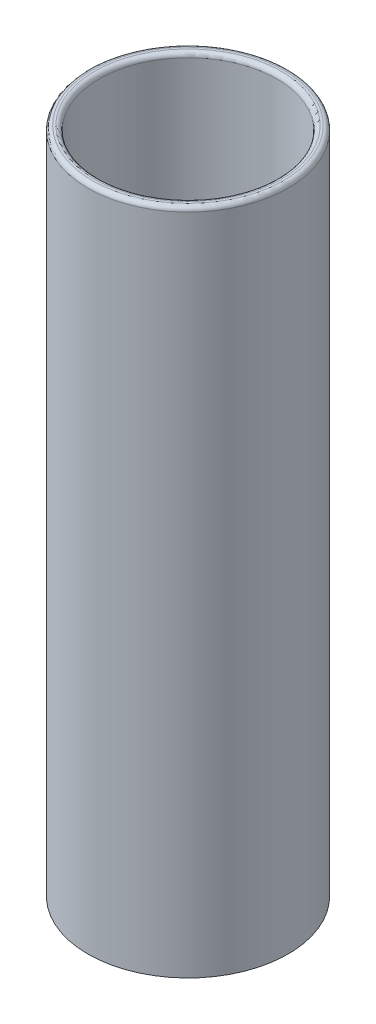
ISO-10303-21;
HEADER;
FILE_DESCRIPTION(('STEP AP214'),'2;1');
FILE_NAME('part.step','',(''),(''),'','','');
FILE_SCHEMA(('AUTOMOTIVE_DESIGN { 1 0 10303 214 1 1 1 1 }'));
ENDSEC;
DATA;
#1=APPLICATION_CONTEXT('core data for automotive mechanical design processes');
#2=APPLICATION_PROTOCOL_DEFINITION('international standard','automotive_design',2000,#1);
#3=PRODUCT_CONTEXT('',#1,'mechanical');
#4=PRODUCT('Part','Part','',(#3));
#5=PRODUCT_RELATED_PRODUCT_CATEGORY('part','',(#4));
#6=PRODUCT_DEFINITION_FORMATION('','',#4);
#7=PRODUCT_DEFINITION_CONTEXT('part definition',#1,'design');
#8=PRODUCT_DEFINITION('design','',#6,#7);
#9=PRODUCT_DEFINITION_SHAPE('','',#8);
#10=(LENGTH_UNIT() NAMED_UNIT(*) SI_UNIT(.MILLI.,.METRE.));
#11=(NAMED_UNIT(*) PLANE_ANGLE_UNIT() SI_UNIT($,.RADIAN.));
#12=(NAMED_UNIT(*) SI_UNIT($,.STERADIAN.) SOLID_ANGLE_UNIT());
#13=UNCERTAINTY_MEASURE_WITH_UNIT(LENGTH_MEASURE(1.E-05),#10,'distance_accuracy_value','');
#14=(GEOMETRIC_REPRESENTATION_CONTEXT(3) GLOBAL_UNCERTAINTY_ASSIGNED_CONTEXT((#13)) GLOBAL_UNIT_ASSIGNED_CONTEXT((#10,
#11,#12)) REPRESENTATION_CONTEXT('',''));
#15=CARTESIAN_POINT('',(0.,0.,0.));
#16=DIRECTION('',(0.,0.,1.));
#17=DIRECTION('',(1.,0.,0.));
#18=AXIS2_PLACEMENT_3D('',#15,#16,#17);
#19=CARTESIAN_POINT('',(0.,150.,0.));
#20=DIRECTION('',(0.,-1.,0.));
#21=DIRECTION('',(0.,0.,-1.));
#22=AXIS2_PLACEMENT_3D('',#19,#20,#21);
#23=CYLINDRICAL_SURFACE('',#22,22.5);
#24=CARTESIAN_POINT('',(0.,149.,0.));
#25=DIRECTION('',(0.,1.,0.));
#26=DIRECTION('',(0.,0.,1.));
#27=AXIS2_PLACEMENT_3D('',#24,#25,#26);
#28=CIRCLE('',#27,22.5);
#29=CARTESIAN_POINT('',(0.,149.,22.5));
#30=VERTEX_POINT('',#29);
#31=EDGE_CURVE('E51',#30,#30,#28,.F.);
#32=ORIENTED_EDGE('',*,*,#31,.T.);
#33=EDGE_LOOP('',(#32));
#34=FACE_BOUND('',#33,.T.);
#35=CARTESIAN_POINT('',(0.,0.,0.));
#36=DIRECTION('',(0.,1.,0.));
#37=DIRECTION('',(0.,0.,1.));
#38=AXIS2_PLACEMENT_3D('',#35,#36,#37);
#39=CIRCLE('',#38,22.5);
#40=CARTESIAN_POINT('',(0.,0.,22.5));
#41=VERTEX_POINT('',#40);
#42=EDGE_CURVE('E67',#41,#41,#39,.T.);
#43=ORIENTED_EDGE('',*,*,#42,.T.);
#44=EDGE_LOOP('',(#43));
#45=FACE_BOUND('',#44,.T.);
#46=ADVANCED_FACE('F43',(#34,#45),#23,.T.);
#47=CARTESIAN_POINT('',(0.,150.,0.));
#48=DIRECTION('',(0.,1.,0.));
#49=DIRECTION('',(0.,0.,1.));
#50=AXIS2_PLACEMENT_3D('',#47,#48,#49);
#51=PLANE('',#50);
#52=CARTESIAN_POINT('',(0.,150.,0.));
#53=DIRECTION('',(0.,1.,0.));
#54=DIRECTION('',(0.,0.,1.));
#55=AXIS2_PLACEMENT_3D('',#52,#53,#54);
#56=CIRCLE('',#55,21.5);
#57=CARTESIAN_POINT('',(0.,150.,21.5));
#58=VERTEX_POINT('',#57);
#59=EDGE_CURVE('E56',#58,#58,#56,.T.);
#60=ORIENTED_EDGE('',*,*,#59,.T.);
#61=EDGE_LOOP('',(#60));
#62=FACE_BOUND('',#61,.T.);
#63=CARTESIAN_POINT('',(0.,150.,0.));
#64=DIRECTION('',(0.,1.,0.));
#65=DIRECTION('',(0.,0.,1.));
#66=AXIS2_PLACEMENT_3D('',#63,#64,#65);
#67=CIRCLE('',#66,21.);
#68=CARTESIAN_POINT('',(0.,150.,21.));
#69=VERTEX_POINT('',#68);
#70=EDGE_CURVE('E61',#69,#69,#67,.F.);
#71=ORIENTED_EDGE('',*,*,#70,.T.);
#72=EDGE_LOOP('',(#71));
#73=FACE_BOUND('',#72,.T.);
#74=ADVANCED_FACE('F88',(#62,#73),#51,.T.);
#75=CARTESIAN_POINT('',(0.,0.,0.));
#76=DIRECTION('',(0.,1.,0.));
#77=DIRECTION('',(0.,0.,1.));
#78=AXIS2_PLACEMENT_3D('',#75,#76,#77);
#79=PLANE('',#78);
#80=ORIENTED_EDGE('',*,*,#42,.F.);
#81=EDGE_LOOP('',(#80));
#82=FACE_BOUND('',#81,.T.);
#83=ADVANCED_FACE('F80',(#82),#79,.F.);
#84=CARTESIAN_POINT('',(0.,9.99999999999998,0.));
#85=DIRECTION('',(0.,1.,0.));
#86=DIRECTION('',(0.,0.,1.));
#87=AXIS2_PLACEMENT_3D('',#84,#85,#86);
#88=CYLINDRICAL_SURFACE('',#87,20.);
#89=CARTESIAN_POINT('',(0.,149.,0.));
#90=DIRECTION('',(0.,1.,0.));
#91=DIRECTION('',(0.,0.,1.));
#92=AXIS2_PLACEMENT_3D('',#89,#90,#91);
#93=CIRCLE('',#92,20.);
#94=CARTESIAN_POINT('',(0.,149.,20.));
#95=VERTEX_POINT('',#94);
#96=EDGE_CURVE('E10',#95,#95,#93,.T.);
#97=ORIENTED_EDGE('',*,*,#96,.T.);
#98=EDGE_LOOP('',(#97));
#99=FACE_BOUND('',#98,.T.);
#100=CARTESIAN_POINT('',(0.,9.99999999999998,0.));
#101=DIRECTION('',(0.,1.,0.));
#102=DIRECTION('',(0.,0.,1.));
#103=AXIS2_PLACEMENT_3D('',#100,#101,#102);
#104=CIRCLE('',#103,20.);
#105=CARTESIAN_POINT('',(0.,9.99999999999998,20.));
#106=VERTEX_POINT('',#105);
#107=EDGE_CURVE('E71',#106,#106,#104,.T.);
#108=ORIENTED_EDGE('',*,*,#107,.F.);
#109=EDGE_LOOP('',(#108));
#110=FACE_BOUND('',#109,.T.);
#111=ADVANCED_FACE('F78',(#99,#110),#88,.F.);
#112=CARTESIAN_POINT('',(0.,9.99999999999998,0.));
#113=DIRECTION('',(0.,1.,0.));
#114=DIRECTION('',(0.,0.,1.));
#115=AXIS2_PLACEMENT_3D('',#112,#113,#114);
#116=PLANE('',#115);
#117=ORIENTED_EDGE('',*,*,#107,.T.);
#118=EDGE_LOOP('',(#117));
#119=FACE_BOUND('',#118,.T.);
#120=ADVANCED_FACE('F76',(#119),#116,.T.);
#121=CARTESIAN_POINT('',(0.,149.,0.));
#122=DIRECTION('',(0.,1.,0.));
#123=DIRECTION('',(0.,0.,1.));
#124=AXIS2_PLACEMENT_3D('',#121,#122,#123);
#125=TOROIDAL_SURFACE('',#124,21.5,1.);
#126=ORIENTED_EDGE('',*,*,#31,.F.);
#127=EDGE_LOOP('',(#126));
#128=FACE_BOUND('',#127,.T.);
#129=ORIENTED_EDGE('',*,*,#59,.F.);
#130=EDGE_LOOP('',(#129));
#131=FACE_BOUND('',#130,.T.);
#132=ADVANCED_FACE('F86',(#128,#131),#125,.T.);
#133=CARTESIAN_POINT('',(0.,149.,0.));
#134=DIRECTION('',(0.,1.,0.));
#135=DIRECTION('',(0.,0.,1.));
#136=AXIS2_PLACEMENT_3D('',#133,#134,#135);
#137=TOROIDAL_SURFACE('',#136,21.,1.);
#138=ORIENTED_EDGE('',*,*,#70,.F.);
#139=EDGE_LOOP('',(#138));
#140=FACE_BOUND('',#139,.T.);
#141=ORIENTED_EDGE('',*,*,#96,.F.);
#142=EDGE_LOOP('',(#141));
#143=FACE_BOUND('',#142,.T.);
#144=ADVANCED_FACE('F45',(#140,#143),#137,.T.);
#145=CLOSED_SHELL('',(#46,#74,#83,#111,#120,#132,#144));
#146=MANIFOLD_SOLID_BREP('B2',#145);
#147=ADVANCED_BREP_SHAPE_REPRESENTATION('',(#18,#146),#14);
#148=SHAPE_DEFINITION_REPRESENTATION(#9,#147);
ENDSEC;
END-ISO-10303-21;
